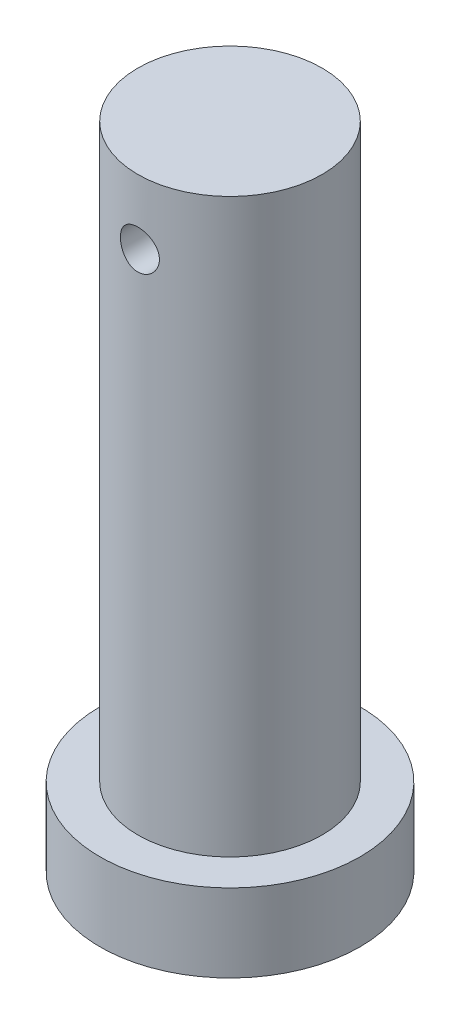
ISO-10303-21;
HEADER;
FILE_DESCRIPTION(('STEP AP214'),'2;1');
FILE_NAME('part.step','',(''),(''),'','','');
FILE_SCHEMA(('AUTOMOTIVE_DESIGN { 1 0 10303 214 1 1 1 1 }'));
ENDSEC;
DATA;
#1=APPLICATION_CONTEXT('core data for automotive mechanical design processes');
#2=APPLICATION_PROTOCOL_DEFINITION('international standard','automotive_design',2000,#1);
#3=PRODUCT_CONTEXT('',#1,'mechanical');
#4=PRODUCT('Part','Part','',(#3));
#5=PRODUCT_RELATED_PRODUCT_CATEGORY('part','',(#4));
#6=PRODUCT_DEFINITION_FORMATION('','',#4);
#7=PRODUCT_DEFINITION_CONTEXT('part definition',#1,'design');
#8=PRODUCT_DEFINITION('design','',#6,#7);
#9=PRODUCT_DEFINITION_SHAPE('','',#8);
#10=(LENGTH_UNIT() NAMED_UNIT(*) SI_UNIT(.MILLI.,.METRE.));
#11=(NAMED_UNIT(*) PLANE_ANGLE_UNIT() SI_UNIT($,.RADIAN.));
#12=(NAMED_UNIT(*) SI_UNIT($,.STERADIAN.) SOLID_ANGLE_UNIT());
#13=UNCERTAINTY_MEASURE_WITH_UNIT(LENGTH_MEASURE(1.E-05),#10,'distance_accuracy_value','');
#14=(GEOMETRIC_REPRESENTATION_CONTEXT(3) GLOBAL_UNCERTAINTY_ASSIGNED_CONTEXT((#13)) GLOBAL_UNIT_ASSIGNED_CONTEXT((#10,
#11,#12)) REPRESENTATION_CONTEXT('',''));
#15=CARTESIAN_POINT('',(0.,0.,0.));
#16=DIRECTION('',(0.,0.,1.));
#17=DIRECTION('',(1.,0.,0.));
#18=AXIS2_PLACEMENT_3D('',#15,#16,#17);
#19=CARTESIAN_POINT('',(0.,0.,0.));
#20=DIRECTION('',(0.,1.,0.));
#21=DIRECTION('',(-1.,0.,0.));
#22=AXIS2_PLACEMENT_3D('',#19,#20,#21);
#23=PLANE('',#22);
#24=CARTESIAN_POINT('',(0.,0.,0.));
#25=DIRECTION('',(0.,1.,0.));
#26=DIRECTION('',(-1.,0.,0.));
#27=AXIS2_PLACEMENT_3D('',#24,#25,#26);
#28=CIRCLE('',#27,25.);
#29=CARTESIAN_POINT('',(-25.,0.,0.));
#30=VERTEX_POINT('',#29);
#31=EDGE_CURVE('E10',#30,#30,#28,.T.);
#32=ORIENTED_EDGE('',*,*,#31,.F.);
#33=EDGE_LOOP('',(#32));
#34=FACE_BOUND('',#33,.T.);
#35=ADVANCED_FACE('F41',(#34),#23,.F.);
#36=CARTESIAN_POINT('',(0.,125.,0.));
#37=DIRECTION('',(0.,1.,0.));
#38=DIRECTION('',(-1.,0.,0.));
#39=AXIS2_PLACEMENT_3D('',#36,#37,#38);
#40=CYLINDRICAL_SURFACE('',#39,25.);
#41=CARTESIAN_POINT('',(0.,15.,0.));
#42=DIRECTION('',(0.,1.,0.));
#43=DIRECTION('',(-1.,0.,0.));
#44=AXIS2_PLACEMENT_3D('',#41,#42,#43);
#45=CIRCLE('',#44,25.);
#46=CARTESIAN_POINT('',(-25.,15.,0.));
#47=VERTEX_POINT('',#46);
#48=EDGE_CURVE('E54',#47,#47,#45,.T.);
#49=ORIENTED_EDGE('',*,*,#48,.F.);
#50=EDGE_LOOP('',(#49));
#51=FACE_BOUND('',#50,.T.);
#52=ORIENTED_EDGE('',*,*,#31,.T.);
#53=EDGE_LOOP('',(#52));
#54=FACE_BOUND('',#53,.T.);
#55=ADVANCED_FACE('F89',(#51,#54),#40,.T.);
#56=CARTESIAN_POINT('',(25.,15.,0.));
#57=DIRECTION('',(0.,-1.,0.));
#58=DIRECTION('',(1.,0.,0.));
#59=AXIS2_PLACEMENT_3D('',#56,#57,#58);
#60=PLANE('',#59);
#61=CARTESIAN_POINT('',(0.,15.,0.));
#62=DIRECTION('',(0.,1.,0.));
#63=DIRECTION('',(-1.,0.,0.));
#64=AXIS2_PLACEMENT_3D('',#61,#62,#63);
#65=CIRCLE('',#64,17.7222);
#66=CARTESIAN_POINT('',(-17.7222,15.,0.));
#67=VERTEX_POINT('',#66);
#68=EDGE_CURVE('E61',#67,#67,#65,.T.);
#69=ORIENTED_EDGE('',*,*,#68,.F.);
#70=EDGE_LOOP('',(#69));
#71=FACE_BOUND('',#70,.T.);
#72=ORIENTED_EDGE('',*,*,#48,.T.);
#73=EDGE_LOOP('',(#72));
#74=FACE_BOUND('',#73,.T.);
#75=ADVANCED_FACE('F85',(#71,#74),#60,.F.);
#76=CARTESIAN_POINT('',(0.,125.,0.));
#77=DIRECTION('',(0.,1.,0.));
#78=DIRECTION('',(-1.,0.,0.));
#79=AXIS2_PLACEMENT_3D('',#76,#77,#78);
#80=CYLINDRICAL_SURFACE('',#79,17.7222);
#81=CARTESIAN_POINT('',(3.75,112.5,-17.3209085454545));
#82=CARTESIAN_POINT('',(3.74999262317846,112.708093377559,-17.3209127403599));
#83=CARTESIAN_POINT('',(3.73261997860774,112.916277044266,-17.3246994128075));
#84=CARTESIAN_POINT('',(3.66365734999549,113.326736132959,-17.3394113210448));
#85=CARTESIAN_POINT('',(3.61204159866976,113.529006985906,-17.3503419324201));
#86=CARTESIAN_POINT('',(3.47628071020748,113.921643316706,-17.378049597833));
#87=CARTESIAN_POINT('',(3.39216995789181,114.112021132715,-17.3948204701126));
#88=CARTESIAN_POINT('',(3.19390346373044,114.475963940299,-17.4323116003607));
#89=CARTESIAN_POINT('',(3.0797487513,114.649529507645,-17.4530317230067));
#90=CARTESIAN_POINT('',(2.8227102243032,114.977671220932,-17.4964528436146));
#91=CARTESIAN_POINT('',(2.67944149998642,115.131942743113,-17.5191777906157));
#92=CARTESIAN_POINT('',(2.36907303755115,115.4144525696,-17.5638379340189));
#93=CARTESIAN_POINT('',(2.20197152130571,115.542688929732,-17.5857730713415));
#94=CARTESIAN_POINT('',(1.84664821708078,115.770684358623,-17.6266419499506));
#95=CARTESIAN_POINT('',(1.6582353617803,115.870151796008,-17.6455441445425));
#96=CARTESIAN_POINT('',(1.2669029854327,116.035901031209,-17.6779474301966));
#97=CARTESIAN_POINT('',(1.0639849888309,116.102186310525,-17.6914490878576));
#98=CARTESIAN_POINT('',(0.652567580719971,116.198735348537,-17.7113608065571));
#99=CARTESIAN_POINT('',(0.444194041340725,116.229514231484,-17.7178721830305));
#100=CARTESIAN_POINT('',(0.0251460275708707,116.255786023133,-17.7234202773815));
#101=CARTESIAN_POINT('',(-0.185528197367934,116.251282720109,-17.7224577977324));
#102=CARTESIAN_POINT('',(-0.599650668847649,116.207504380898,-17.7132444762233));
#103=CARTESIAN_POINT('',(-0.803160564023209,116.168784436707,-17.7051099896601));
#104=CARTESIAN_POINT('',(-1.20072724293187,116.058554884073,-17.6825986819167));
#105=CARTESIAN_POINT('',(-1.39478361731766,115.987043857135,-17.668221590692));
#106=CARTESIAN_POINT('',(-1.76949226205793,115.812762041542,-17.6346515461538));
#107=CARTESIAN_POINT('',(-1.95004234186692,115.709778093599,-17.6154259149491));
#108=CARTESIAN_POINT('',(-2.29150208321449,115.47563223176,-17.574271331142));
#109=CARTESIAN_POINT('',(-2.4524092261398,115.344466710367,-17.5523420325989));
#110=CARTESIAN_POINT('',(-2.75331424766757,115.054649805473,-17.5076914056489));
#111=CARTESIAN_POINT('',(-2.89284352514331,114.895512582164,-17.4849629705469));
#112=CARTESIAN_POINT('',(-3.14331748073307,114.555864767729,-17.4416780316321));
#113=CARTESIAN_POINT('',(-3.25426148100088,114.37535366991,-17.4211215793306));
#114=CARTESIAN_POINT('',(-3.44460544567756,113.997357726212,-17.3844910940221));
#115=CARTESIAN_POINT('',(-3.52392183288318,113.799829563272,-17.3684289703895));
#116=CARTESIAN_POINT('',(-3.64809745225986,113.393829338666,-17.3427742763144));
#117=CARTESIAN_POINT('',(-3.69296176518216,113.185358895537,-17.3331807519537));
#118=CARTESIAN_POINT('',(-3.74624324397612,112.76766009111,-17.321742710072));
#119=CARTESIAN_POINT('',(-3.75534053082154,112.558522345409,-17.3197536124913));
#120=CARTESIAN_POINT('',(-3.73866669739234,112.141718310905,-17.3233603789464));
#121=CARTESIAN_POINT('',(-3.71289780756497,111.934051928831,-17.3289557577907));
#122=CARTESIAN_POINT('',(-3.62781175603404,111.528421461802,-17.3469649281265));
#123=CARTESIAN_POINT('',(-3.56886480360997,111.330376071787,-17.3593034347225));
#124=CARTESIAN_POINT('',(-3.41949479846595,110.946972633265,-17.3893414522287));
#125=CARTESIAN_POINT('',(-3.32906889399048,110.76161573606,-17.4070414488305));
#126=CARTESIAN_POINT('',(-3.11779340887312,110.405894821698,-17.4461285497627));
#127=CARTESIAN_POINT('',(-2.99652228144576,110.235786744496,-17.467565329004));
#128=CARTESIAN_POINT('',(-2.72755439164384,109.918086323327,-17.5115775650937));
#129=CARTESIAN_POINT('',(-2.57985456808568,109.770496591289,-17.5341531536303));
#130=CARTESIAN_POINT('',(-2.25915377249306,109.499406461982,-17.5783730388198));
#131=CARTESIAN_POINT('',(-2.08575840667884,109.376368268524,-17.5999943920104));
#132=CARTESIAN_POINT('',(-1.72036426394339,109.161168561999,-17.6394568181403));
#133=CARTESIAN_POINT('',(-1.52836632473976,109.069005659377,-17.6572980611917));
#134=CARTESIAN_POINT('',(-1.13237181293258,108.918828173017,-17.6870928075675));
#135=CARTESIAN_POINT('',(-0.928456948272551,108.86060555932,-17.6990821038446));
#136=CARTESIAN_POINT('',(-0.51345994497011,108.779307778374,-17.7159763748215));
#137=CARTESIAN_POINT('',(-0.30237878201117,108.756227845952,-17.7208823099854));
#138=CARTESIAN_POINT('',(0.116560832719891,108.746073283603,-17.7230308401985));
#139=CARTESIAN_POINT('',(0.324402062843799,108.758306724024,-17.7204207074236));
#140=CARTESIAN_POINT('',(0.734994933660253,108.816891729548,-17.7081436067735));
#141=CARTESIAN_POINT('',(0.937746654628512,108.863242756171,-17.698476750275));
#142=CARTESIAN_POINT('',(1.33191041798981,108.988424776035,-17.6731806640817));
#143=CARTESIAN_POINT('',(1.52335293699508,109.067163450386,-17.6575683907202));
#144=CARTESIAN_POINT('',(1.89040430753438,109.254793312458,-17.6220539549752));
#145=CARTESIAN_POINT('',(2.066011728651,109.363687220555,-17.6021514055916));
#146=CARTESIAN_POINT('',(2.39980151247035,109.610823120376,-17.5597884397093));
#147=CARTESIAN_POINT('',(2.55761616742307,109.749555050576,-17.5372886507353));
#148=CARTESIAN_POINT('',(2.84796223724989,110.051433301696,-17.4924874475652));
#149=CARTESIAN_POINT('',(2.98048759586125,110.214585454104,-17.4701860821035));
#150=CARTESIAN_POINT('',(3.21805989106317,110.563091032504,-17.4280016019896));
#151=CARTESIAN_POINT('',(3.32274774875285,110.748693468642,-17.408151706626));
#152=CARTESIAN_POINT('',(3.49928129047304,111.135232094083,-17.3735304123889));
#153=CARTESIAN_POINT('',(3.57115555676738,111.336154759961,-17.3587545965321));
#154=CARTESIAN_POINT('',(3.6667550315034,111.69781940775,-17.3387719502576));
#155=CARTESIAN_POINT('',(3.69791362140268,111.856558370175,-17.3321164661325));
#156=CARTESIAN_POINT('',(3.73953852764504,112.176846817698,-17.3231832284598));
#157=CARTESIAN_POINT('',(3.75000572878646,112.338396182321,-17.3209052877212));
#158=CARTESIAN_POINT('',(3.75,112.5,-17.3209085454545));
#159=B_SPLINE_CURVE_WITH_KNOTS('',3,(#81,#82,#83,#84,#85,#86,#87,#88,#89,#90,#91,#92,#93,#94,
#95,#96,#97,#98,#99,#100,#101,#102,#103,#104,#105,#106,#107,#108,#109,#110,#111,#112,#113,#114,
#115,#116,#117,#118,#119,#120,#121,#122,#123,#124,#125,#126,#127,#128,#129,#130,#131,#132,#133,
#134,#135,#136,#137,#138,#139,#140,#141,#142,#143,#144,#145,#146,#147,#148,#149,#150,#151,#152,
#153,#154,#155,#156,#157,#158),.UNSPECIFIED.,.T.,.F.,(4,2,2,2,2,2,2,2,2,2,2,2,2,2,2,2,2,2,2,2,2,
2,2,2,2,2,2,2,2,2,2,2,2,2,2,2,2,2,4),(0.,0.623688090543544,1.24784602759236,1.87134530840722,
2.49482322865153,3.12715391539679,3.75953180403847,4.39811185432496,5.03662489022359,
5.66575306846343,6.29481369768977,6.91385275136083,7.53291858628581,8.1562737999039,
8.77970885623473,9.41529368384851,10.0508935817771,10.6881621200715,11.3253366603958,
11.9503347936719,12.5752929466693,13.1934120958477,13.8115872565353,14.4387129619278,
15.0659113531267,15.7039879007302,16.3420357275908,16.9761304972284,17.6101392790794,
18.2318101300843,18.853471169442,19.4733723505521,20.0933294726495,20.7243716110697,
21.3555646818813,21.9945428733454,22.6329634162214,23.1173358066246,23.6016874840072),.UNSPECIFIED.);
#160=CARTESIAN_POINT('',(3.75,112.5,-17.3209085454545));
#161=VERTEX_POINT('',#160);
#162=EDGE_CURVE('E44',#161,#161,#159,.T.);
#163=ORIENTED_EDGE('',*,*,#162,.T.);
#164=EDGE_LOOP('',(#163));
#165=FACE_BOUND('',#164,.T.);
#166=CARTESIAN_POINT('',(3.75,112.5,17.3209085454545));
#167=CARTESIAN_POINT('',(3.74999262317846,112.291906622441,17.3209127403599));
#168=CARTESIAN_POINT('',(3.73261997860774,112.083722955734,17.3246994128075));
#169=CARTESIAN_POINT('',(3.6636573499955,111.673263867041,17.3394113210448));
#170=CARTESIAN_POINT('',(3.61204159866976,111.470993014094,17.3503419324201));
#171=CARTESIAN_POINT('',(3.47628071020748,111.078356683294,17.378049597833));
#172=CARTESIAN_POINT('',(3.39216995789181,110.887978867285,17.3948204701126));
#173=CARTESIAN_POINT('',(3.19390346373044,110.524036059701,17.4323116003607));
#174=CARTESIAN_POINT('',(3.0797487513,110.350470492355,17.4530317230067));
#175=CARTESIAN_POINT('',(2.82271022430321,110.022328779068,17.4964528436146));
#176=CARTESIAN_POINT('',(2.67944149998643,109.868057256887,17.5191777906157));
#177=CARTESIAN_POINT('',(2.36907303755117,109.5855474304,17.5638379340189));
#178=CARTESIAN_POINT('',(2.20197152130572,109.457311070268,17.5857730713415));
#179=CARTESIAN_POINT('',(1.84664821708078,109.229315641377,17.6266419499506));
#180=CARTESIAN_POINT('',(1.6582353617803,109.129848203993,17.6455441445425));
#181=CARTESIAN_POINT('',(1.2669029854327,108.964098968791,17.6779474301966));
#182=CARTESIAN_POINT('',(1.0639849888309,108.897813689475,17.6914490878576));
#183=CARTESIAN_POINT('',(0.652567580719972,108.801264651463,17.7113608065571));
#184=CARTESIAN_POINT('',(0.444194041340725,108.770485768516,17.7178721830305));
#185=CARTESIAN_POINT('',(0.0251460275708711,108.744213976867,17.7234202773815));
#186=CARTESIAN_POINT('',(-0.185528197367934,108.748717279891,17.7224577977324));
#187=CARTESIAN_POINT('',(-0.599650668847648,108.792495619102,17.7132444762233));
#188=CARTESIAN_POINT('',(-0.803160564023209,108.831215563293,17.7051099896601));
#189=CARTESIAN_POINT('',(-1.20072724293187,108.941445115927,17.6825986819167));
#190=CARTESIAN_POINT('',(-1.39478361731766,109.012956142865,17.668221590692));
#191=CARTESIAN_POINT('',(-1.76949226205793,109.187237958458,17.6346515461538));
#192=CARTESIAN_POINT('',(-1.95004234186692,109.290221906401,17.6154259149491));
#193=CARTESIAN_POINT('',(-2.29150208321449,109.52436776824,17.574271331142));
#194=CARTESIAN_POINT('',(-2.4524092261398,109.655533289633,17.5523420325989));
#195=CARTESIAN_POINT('',(-2.75331424766757,109.945350194527,17.5076914056489));
#196=CARTESIAN_POINT('',(-2.89284352514331,110.104487417836,17.4849629705469));
#197=CARTESIAN_POINT('',(-3.14331748073307,110.444135232271,17.4416780316321));
#198=CARTESIAN_POINT('',(-3.25426148100088,110.62464633009,17.4211215793306));
#199=CARTESIAN_POINT('',(-3.44460544567756,111.002642273789,17.3844910940221));
#200=CARTESIAN_POINT('',(-3.52392183288318,111.200170436728,17.3684289703895));
#201=CARTESIAN_POINT('',(-3.64809745225986,111.606170661334,17.3427742763144));
#202=CARTESIAN_POINT('',(-3.69296176518216,111.814641104463,17.3331807519537));
#203=CARTESIAN_POINT('',(-3.74624324397612,112.23233990889,17.321742710072));
#204=CARTESIAN_POINT('',(-3.75534053082154,112.441477654591,17.3197536124913));
#205=CARTESIAN_POINT('',(-3.73866669739234,112.858281689095,17.3233603789464));
#206=CARTESIAN_POINT('',(-3.71289780756497,113.065948071169,17.3289557577907));
#207=CARTESIAN_POINT('',(-3.62781175603405,113.471578538198,17.3469649281265));
#208=CARTESIAN_POINT('',(-3.56886480360998,113.669623928213,17.3593034347225));
#209=CARTESIAN_POINT('',(-3.41949479846596,114.053027366735,17.3893414522287));
#210=CARTESIAN_POINT('',(-3.32906889399049,114.23838426394,17.4070414488305));
#211=CARTESIAN_POINT('',(-3.11779340887312,114.594105178302,17.4461285497627));
#212=CARTESIAN_POINT('',(-2.99652228144576,114.764213255504,17.467565329004));
#213=CARTESIAN_POINT('',(-2.72755439164384,115.081913676673,17.5115775650937));
#214=CARTESIAN_POINT('',(-2.57985456808568,115.229503408711,17.5341531536303));
#215=CARTESIAN_POINT('',(-2.25915377249306,115.500593538018,17.5783730388198));
#216=CARTESIAN_POINT('',(-2.08575840667884,115.623631731476,17.5999943920104));
#217=CARTESIAN_POINT('',(-1.7203642639434,115.838831438001,17.6394568181403));
#218=CARTESIAN_POINT('',(-1.52836632473976,115.930994340623,17.6572980611917));
#219=CARTESIAN_POINT('',(-1.13237181293258,116.081171826983,17.6870928075675));
#220=CARTESIAN_POINT('',(-0.928456948272553,116.13939444068,17.6990821038446));
#221=CARTESIAN_POINT('',(-0.513459944970111,116.220692221626,17.7159763748215));
#222=CARTESIAN_POINT('',(-0.302378782011169,116.243772154048,17.7208823099854));
#223=CARTESIAN_POINT('',(0.116560832719893,116.253926716397,17.7230308401985));
#224=CARTESIAN_POINT('',(0.324402062843802,116.241693275976,17.7204207074236));
#225=CARTESIAN_POINT('',(0.734994933660255,116.183108270452,17.7081436067735));
#226=CARTESIAN_POINT('',(0.937746654628513,116.136757243829,17.698476750275));
#227=CARTESIAN_POINT('',(1.33191041798981,116.011575223965,17.6731806640817));
#228=CARTESIAN_POINT('',(1.52335293699509,115.932836549614,17.6575683907202));
#229=CARTESIAN_POINT('',(1.89040430753438,115.745206687542,17.6220539549752));
#230=CARTESIAN_POINT('',(2.066011728651,115.636312779445,17.6021514055916));
#231=CARTESIAN_POINT('',(2.39980151247035,115.389176879624,17.5597884397093));
#232=CARTESIAN_POINT('',(2.55761616742307,115.250444949424,17.5372886507353));
#233=CARTESIAN_POINT('',(2.84796223724989,114.948566698304,17.4924874475652));
#234=CARTESIAN_POINT('',(2.98048759586125,114.785414545896,17.4701860821035));
#235=CARTESIAN_POINT('',(3.21805989106317,114.436908967496,17.4280016019896));
#236=CARTESIAN_POINT('',(3.32274774875286,114.251306531358,17.408151706626));
#237=CARTESIAN_POINT('',(3.49928129047305,113.864767905917,17.3735304123889));
#238=CARTESIAN_POINT('',(3.57115555676738,113.663845240039,17.3587545965321));
#239=CARTESIAN_POINT('',(3.6667550315034,113.30218059225,17.3387719502576));
#240=CARTESIAN_POINT('',(3.69791362140268,113.143441629825,17.3321164661325));
#241=CARTESIAN_POINT('',(3.73953852764504,112.823153182302,17.3231832284598));
#242=CARTESIAN_POINT('',(3.75000572878646,112.661603817679,17.3209052877212));
#243=CARTESIAN_POINT('',(3.75,112.5,17.3209085454545));
#244=B_SPLINE_CURVE_WITH_KNOTS('',3,(#166,#167,#168,#169,#170,#171,#172,#173,#174,#175,#176,
#177,#178,#179,#180,#181,#182,#183,#184,#185,#186,#187,#188,#189,#190,#191,#192,#193,#194,#195,
#196,#197,#198,#199,#200,#201,#202,#203,#204,#205,#206,#207,#208,#209,#210,#211,#212,#213,#214,
#215,#216,#217,#218,#219,#220,#221,#222,#223,#224,#225,#226,#227,#228,#229,#230,#231,#232,#233,
#234,#235,#236,#237,#238,#239,#240,#241,#242,#243),.UNSPECIFIED.,.T.,.F.,(4,2,2,2,2,2,2,2,2,2,2,
2,2,2,2,2,2,2,2,2,2,2,2,2,2,2,2,2,2,2,2,2,2,2,2,2,2,2,4),(0.,0.62368809054353,1.24784602759236,
1.87134530840722,2.49482322865153,3.12715391539676,3.75953180403847,4.39811185432495,
5.03662489022359,5.66575306846343,6.29481369768977,6.91385275136083,7.53291858628581,
8.1562737999039,8.77970885623473,9.4152936838485,10.0508935817771,10.6881621200715,
11.3253366603958,11.9503347936718,12.5752929466693,13.1934120958477,13.8115872565353,
14.4387129619278,15.0659113531267,15.7039879007302,16.3420357275909,16.9761304972284,
17.6101392790794,18.2318101300843,18.853471169442,19.4733723505521,20.0933294726496,
20.7243716110697,21.3555646818814,21.9945428733455,22.6329634162214,23.1173358066246,
23.6016874840072),.UNSPECIFIED.);
#245=CARTESIAN_POINT('',(3.75,112.5,17.3209085454545));
#246=VERTEX_POINT('',#245);
#247=EDGE_CURVE('E64',#246,#246,#244,.T.);
#248=ORIENTED_EDGE('',*,*,#247,.T.);
#249=EDGE_LOOP('',(#248));
#250=FACE_BOUND('',#249,.T.);
#251=CARTESIAN_POINT('',(0.,125.,0.));
#252=DIRECTION('',(0.,1.,0.));
#253=DIRECTION('',(-1.,0.,0.));
#254=AXIS2_PLACEMENT_3D('',#251,#252,#253);
#255=CIRCLE('',#254,17.7222);
#256=CARTESIAN_POINT('',(-17.7222,125.,0.));
#257=VERTEX_POINT('',#256);
#258=EDGE_CURVE('E107',#257,#257,#255,.T.);
#259=ORIENTED_EDGE('',*,*,#258,.F.);
#260=EDGE_LOOP('',(#259));
#261=FACE_BOUND('',#260,.T.);
#262=ORIENTED_EDGE('',*,*,#68,.T.);
#263=EDGE_LOOP('',(#262));
#264=FACE_BOUND('',#263,.T.);
#265=ADVANCED_FACE('F70',(#165,#250,#261,#264),#80,.T.);
#266=CARTESIAN_POINT('',(17.7222,125.,0.));
#267=DIRECTION('',(0.,-1.,0.));
#268=DIRECTION('',(1.,0.,0.));
#269=AXIS2_PLACEMENT_3D('',#266,#267,#268);
#270=PLANE('',#269);
#271=ORIENTED_EDGE('',*,*,#258,.T.);
#272=EDGE_LOOP('',(#271));
#273=FACE_BOUND('',#272,.T.);
#274=ADVANCED_FACE('F77',(#273),#270,.F.);
#275=CARTESIAN_POINT('',(0.,112.5,-25.));
#276=DIRECTION('',(0.,0.,1.));
#277=DIRECTION('',(1.,0.,0.));
#278=AXIS2_PLACEMENT_3D('',#275,#276,#277);
#279=CYLINDRICAL_SURFACE('',#278,3.75);
#280=ORIENTED_EDGE('',*,*,#247,.F.);
#281=EDGE_LOOP('',(#280));
#282=FACE_BOUND('',#281,.T.);
#283=ORIENTED_EDGE('',*,*,#162,.F.);
#284=EDGE_LOOP('',(#283));
#285=FACE_BOUND('',#284,.T.);
#286=ADVANCED_FACE('F74',(#282,#285),#279,.F.);
#287=CLOSED_SHELL('',(#35,#55,#75,#265,#274,#286));
#288=MANIFOLD_SOLID_BREP('B2',#287);
#289=ADVANCED_BREP_SHAPE_REPRESENTATION('',(#18,#288),#14);
#290=SHAPE_DEFINITION_REPRESENTATION(#9,#289);
ENDSEC;
END-ISO-10303-21;
